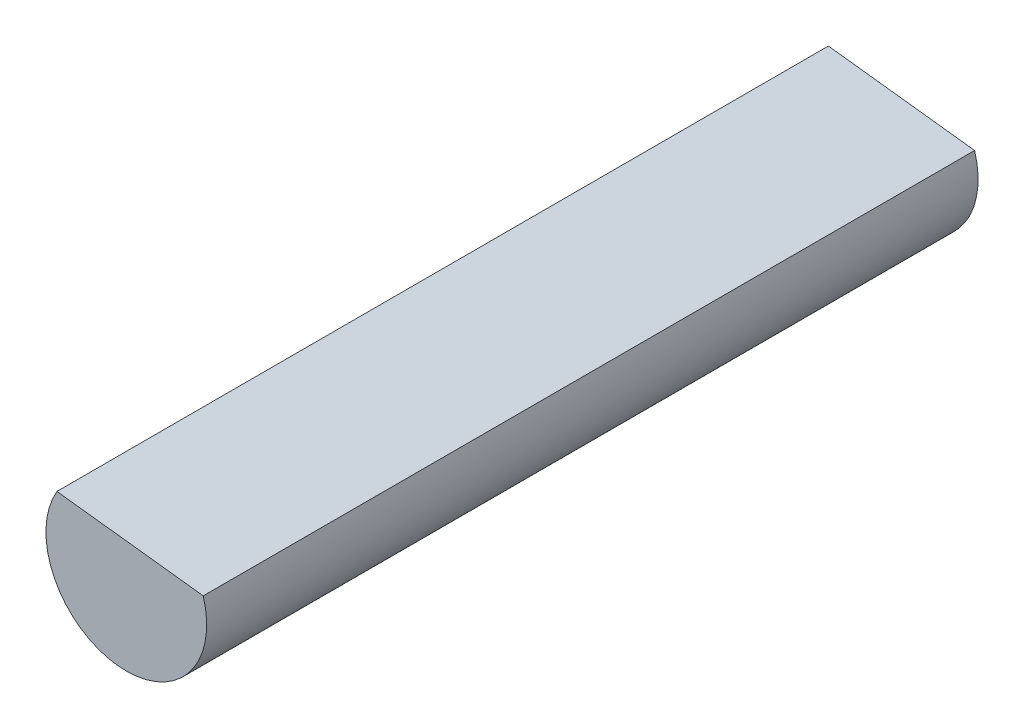
ISO-10303-21;
HEADER;
FILE_DESCRIPTION(('STEP AP214'),'2;1');
FILE_NAME('part.step','',(''),(''),'','','');
FILE_SCHEMA(('AUTOMOTIVE_DESIGN { 1 0 10303 214 1 1 1 1 }'));
ENDSEC;
DATA;
#1=APPLICATION_CONTEXT('core data for automotive mechanical design processes');
#2=APPLICATION_PROTOCOL_DEFINITION('international standard','automotive_design',2000,#1);
#3=PRODUCT_CONTEXT('',#1,'mechanical');
#4=PRODUCT('Part','Part','',(#3));
#5=PRODUCT_RELATED_PRODUCT_CATEGORY('part','',(#4));
#6=PRODUCT_DEFINITION_FORMATION('','',#4);
#7=PRODUCT_DEFINITION_CONTEXT('part definition',#1,'design');
#8=PRODUCT_DEFINITION('design','',#6,#7);
#9=PRODUCT_DEFINITION_SHAPE('','',#8);
#10=(LENGTH_UNIT() NAMED_UNIT(*) SI_UNIT(.MILLI.,.METRE.));
#11=(NAMED_UNIT(*) PLANE_ANGLE_UNIT() SI_UNIT($,.RADIAN.));
#12=(NAMED_UNIT(*) SI_UNIT($,.STERADIAN.) SOLID_ANGLE_UNIT());
#13=UNCERTAINTY_MEASURE_WITH_UNIT(LENGTH_MEASURE(1.E-05),#10,'distance_accuracy_value','');
#14=(GEOMETRIC_REPRESENTATION_CONTEXT(3) GLOBAL_UNCERTAINTY_ASSIGNED_CONTEXT((#13)) GLOBAL_UNIT_ASSIGNED_CONTEXT((#10,
#11,#12)) REPRESENTATION_CONTEXT('',''));
#15=CARTESIAN_POINT('',(0.,0.,0.));
#16=DIRECTION('',(0.,0.,1.));
#17=DIRECTION('',(1.,0.,0.));
#18=AXIS2_PLACEMENT_3D('',#15,#16,#17);
#19=CARTESIAN_POINT('',(0.,0.,48.));
#20=DIRECTION('',(0.,0.,-1.));
#21=DIRECTION('',(-1.,0.,0.));
#22=AXIS2_PLACEMENT_3D('',#19,#20,#21);
#23=CYLINDRICAL_SURFACE('',#22,5.);
#24=CARTESIAN_POINT('',(0.,0.,0.));
#25=DIRECTION('',(0.,0.,1.));
#26=DIRECTION('',(1.,0.,0.));
#27=AXIS2_PLACEMENT_3D('',#24,#25,#26);
#28=CIRCLE('',#27,5.);
#29=CARTESIAN_POINT('',(-4.31573657935327,2.52476093474851,0.));
#30=VERTEX_POINT('',#29);
#31=CARTESIAN_POINT('',(4.78588616918462,1.4475128930712,0.));
#32=VERTEX_POINT('',#31);
#33=EDGE_CURVE('E72',#30,#32,#28,.T.);
#34=ORIENTED_EDGE('',*,*,#33,.T.);
#35=DIRECTION('',(0.,0.,-1.));
#36=VECTOR('',#35,1.);
#37=CARTESIAN_POINT('',(4.78588616918462,1.4475128930712,48.));
#38=LINE('',#37,#36);
#39=CARTESIAN_POINT('',(4.78588616918462,1.4475128930712,48.));
#40=VERTEX_POINT('',#39);
#41=EDGE_CURVE('E11',#40,#32,#38,.T.);
#42=ORIENTED_EDGE('',*,*,#41,.F.);
#43=CARTESIAN_POINT('',(0.,0.,48.));
#44=DIRECTION('',(0.,0.,1.));
#45=DIRECTION('',(1.,0.,0.));
#46=AXIS2_PLACEMENT_3D('',#43,#44,#45);
#47=CIRCLE('',#46,5.);
#48=CARTESIAN_POINT('',(-4.31573657935327,2.52476093474851,48.));
#49=VERTEX_POINT('',#48);
#50=EDGE_CURVE('E71',#49,#40,#47,.T.);
#51=ORIENTED_EDGE('',*,*,#50,.F.);
#52=DIRECTION('',(0.,0.,-1.));
#53=VECTOR('',#52,1.);
#54=CARTESIAN_POINT('',(-4.31573657935327,2.52476093474851,48.));
#55=LINE('',#54,#53);
#56=EDGE_CURVE('E49',#49,#30,#55,.T.);
#57=ORIENTED_EDGE('',*,*,#56,.T.);
#58=EDGE_LOOP('',(#34,#42,#51,#57));
#59=FACE_BOUND('',#58,.T.);
#60=ADVANCED_FACE('F41',(#59),#23,.T.);
#61=CARTESIAN_POINT('',(4.78588616918462,1.4475128930712,48.));
#62=DIRECTION('',(-0.117537397457839,-0.993068456954926,0.));
#63=DIRECTION('',(0.993068456954926,-0.117537397457839,0.));
#64=AXIS2_PLACEMENT_3D('',#61,#62,#63);
#65=PLANE('',#64);
#66=DIRECTION('',(-0.993068456954926,0.117537397457839,0.));
#67=VECTOR('',#66,1.);
#68=CARTESIAN_POINT('',(4.78588616918462,1.4475128930712,0.));
#69=LINE('',#68,#67);
#70=EDGE_CURVE('E64',#32,#30,#69,.T.);
#71=ORIENTED_EDGE('',*,*,#70,.T.);
#72=ORIENTED_EDGE('',*,*,#56,.F.);
#73=DIRECTION('',(-0.993068456954926,0.117537397457839,0.));
#74=VECTOR('',#73,1.);
#75=CARTESIAN_POINT('',(4.78588616918462,1.4475128930712,48.));
#76=LINE('',#75,#74);
#77=EDGE_CURVE('E56',#40,#49,#76,.T.);
#78=ORIENTED_EDGE('',*,*,#77,.F.);
#79=ORIENTED_EDGE('',*,*,#41,.T.);
#80=EDGE_LOOP('',(#71,#72,#78,#79));
#81=FACE_BOUND('',#80,.T.);
#82=ADVANCED_FACE('F67',(#81),#65,.F.);
#83=CARTESIAN_POINT('',(0.,0.,48.));
#84=DIRECTION('',(0.,0.,1.));
#85=DIRECTION('',(1.,0.,0.));
#86=AXIS2_PLACEMENT_3D('',#83,#84,#85);
#87=PLANE('',#86);
#88=ORIENTED_EDGE('',*,*,#50,.T.);
#89=ORIENTED_EDGE('',*,*,#77,.T.);
#90=EDGE_LOOP('',(#88,#89));
#91=FACE_BOUND('',#90,.T.);
#92=ADVANCED_FACE('F79',(#91),#87,.T.);
#93=CARTESIAN_POINT('',(0.,0.,0.));
#94=DIRECTION('',(0.,0.,1.));
#95=DIRECTION('',(1.,0.,0.));
#96=AXIS2_PLACEMENT_3D('',#93,#94,#95);
#97=PLANE('',#96);
#98=ORIENTED_EDGE('',*,*,#33,.F.);
#99=ORIENTED_EDGE('',*,*,#70,.F.);
#100=EDGE_LOOP('',(#98,#99));
#101=FACE_BOUND('',#100,.T.);
#102=ADVANCED_FACE('F75',(#101),#97,.F.);
#103=CLOSED_SHELL('',(#60,#82,#92,#102));
#104=MANIFOLD_SOLID_BREP('B2',#103);
#105=ADVANCED_BREP_SHAPE_REPRESENTATION('',(#18,#104),#14);
#106=SHAPE_DEFINITION_REPRESENTATION(#9,#105);
ENDSEC;
END-ISO-10303-21;
